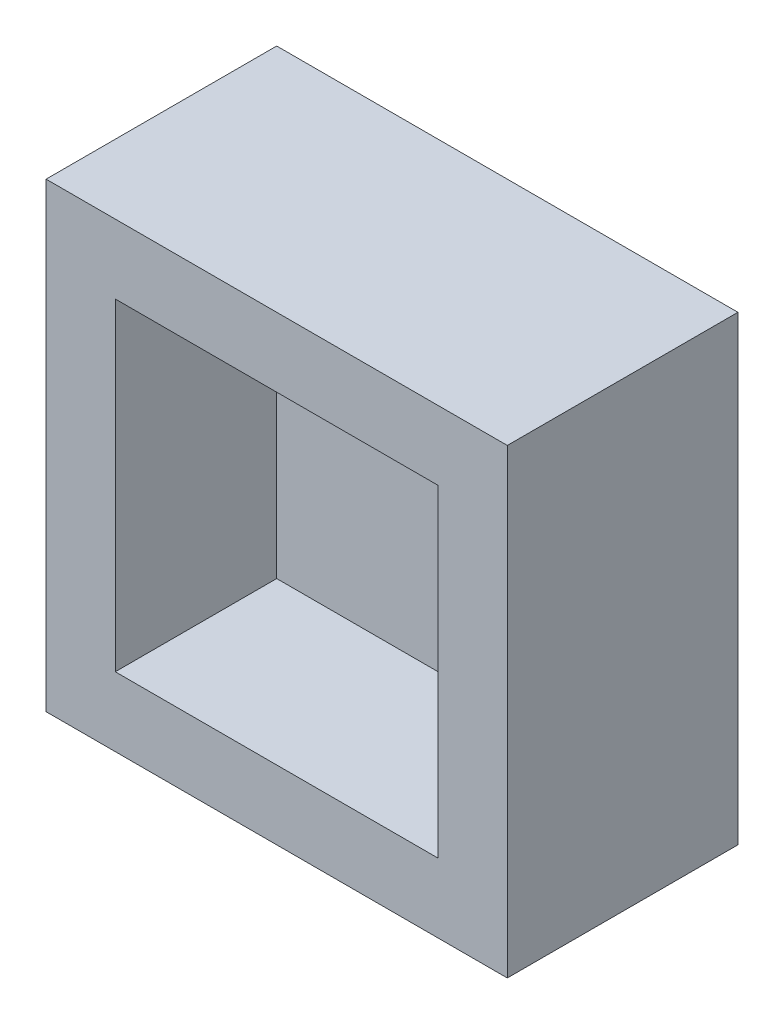
ISO-10303-21;
HEADER;
FILE_DESCRIPTION(('STEP AP214'),'2;1');
FILE_NAME('part.step','',(''),(''),'','','');
FILE_SCHEMA(('AUTOMOTIVE_DESIGN { 1 0 10303 214 1 1 1 1 }'));
ENDSEC;
DATA;
#1=APPLICATION_CONTEXT('core data for automotive mechanical design processes');
#2=APPLICATION_PROTOCOL_DEFINITION('international standard','automotive_design',2000,#1);
#3=PRODUCT_CONTEXT('',#1,'mechanical');
#4=PRODUCT('Part','Part','',(#3));
#5=PRODUCT_RELATED_PRODUCT_CATEGORY('part','',(#4));
#6=PRODUCT_DEFINITION_FORMATION('','',#4);
#7=PRODUCT_DEFINITION_CONTEXT('part definition',#1,'design');
#8=PRODUCT_DEFINITION('design','',#6,#7);
#9=PRODUCT_DEFINITION_SHAPE('','',#8);
#10=(LENGTH_UNIT() NAMED_UNIT(*) SI_UNIT(.MILLI.,.METRE.));
#11=(NAMED_UNIT(*) PLANE_ANGLE_UNIT() SI_UNIT($,.RADIAN.));
#12=(NAMED_UNIT(*) SI_UNIT($,.STERADIAN.) SOLID_ANGLE_UNIT());
#13=UNCERTAINTY_MEASURE_WITH_UNIT(LENGTH_MEASURE(1.E-05),#10,'distance_accuracy_value','');
#14=(GEOMETRIC_REPRESENTATION_CONTEXT(3) GLOBAL_UNCERTAINTY_ASSIGNED_CONTEXT((#13)) GLOBAL_UNIT_ASSIGNED_CONTEXT((#10,
#11,#12)) REPRESENTATION_CONTEXT('',''));
#15=CARTESIAN_POINT('',(0.,0.,0.));
#16=DIRECTION('',(0.,0.,1.));
#17=DIRECTION('',(1.,0.,0.));
#18=AXIS2_PLACEMENT_3D('',#15,#16,#17);
#19=CARTESIAN_POINT('',(0.,0.,10.));
#20=DIRECTION('',(0.,0.,-1.));
#21=DIRECTION('',(-1.,0.,0.));
#22=AXIS2_PLACEMENT_3D('',#19,#20,#21);
#23=PLANE('',#22);
#24=DIRECTION('',(0.,-1.,0.));
#25=VECTOR('',#24,1.);
#26=CARTESIAN_POINT('',(0.,0.,10.));
#27=LINE('',#26,#25);
#28=CARTESIAN_POINT('',(0.,20.,10.));
#29=VERTEX_POINT('',#28);
#30=CARTESIAN_POINT('',(0.,0.,10.));
#31=VERTEX_POINT('',#30);
#32=EDGE_CURVE('E147',#29,#31,#27,.T.);
#33=ORIENTED_EDGE('',*,*,#32,.T.);
#34=DIRECTION('',(1.,0.,0.));
#35=VECTOR('',#34,1.);
#36=CARTESIAN_POINT('',(0.,0.,10.));
#37=LINE('',#36,#35);
#38=CARTESIAN_POINT('',(20.,0.,10.));
#39=VERTEX_POINT('',#38);
#40=EDGE_CURVE('E94',#31,#39,#37,.T.);
#41=ORIENTED_EDGE('',*,*,#40,.T.);
#42=DIRECTION('',(0.,1.,0.));
#43=VECTOR('',#42,1.);
#44=CARTESIAN_POINT('',(20.,0.,10.));
#45=LINE('',#44,#43);
#46=CARTESIAN_POINT('',(20.,20.,10.));
#47=VERTEX_POINT('',#46);
#48=EDGE_CURVE('E153',#39,#47,#45,.T.);
#49=ORIENTED_EDGE('',*,*,#48,.T.);
#50=DIRECTION('',(-1.,0.,0.));
#51=VECTOR('',#50,1.);
#52=CARTESIAN_POINT('',(0.,20.,10.));
#53=LINE('',#52,#51);
#54=EDGE_CURVE('E68',#47,#29,#53,.T.);
#55=ORIENTED_EDGE('',*,*,#54,.T.);
#56=EDGE_LOOP('',(#33,#41,#49,#55));
#57=FACE_BOUND('',#56,.T.);
#58=DIRECTION('',(0.,-1.,0.));
#59=VECTOR('',#58,1.);
#60=CARTESIAN_POINT('',(3.,0.,10.));
#61=LINE('',#60,#59);
#62=CARTESIAN_POINT('',(3.,17.,10.));
#63=VERTEX_POINT('',#62);
#64=CARTESIAN_POINT('',(3.,3.,10.));
#65=VERTEX_POINT('',#64);
#66=EDGE_CURVE('E138',#63,#65,#61,.T.);
#67=ORIENTED_EDGE('',*,*,#66,.F.);
#68=DIRECTION('',(-1.,0.,0.));
#69=VECTOR('',#68,1.);
#70=CARTESIAN_POINT('',(0.,17.,10.));
#71=LINE('',#70,#69);
#72=CARTESIAN_POINT('',(17.,17.,10.));
#73=VERTEX_POINT('',#72);
#74=EDGE_CURVE('E146',#73,#63,#71,.T.);
#75=ORIENTED_EDGE('',*,*,#74,.F.);
#76=DIRECTION('',(0.,1.,0.));
#77=VECTOR('',#76,1.);
#78=CARTESIAN_POINT('',(17.,0.,10.));
#79=LINE('',#78,#77);
#80=CARTESIAN_POINT('',(17.,3.,10.));
#81=VERTEX_POINT('',#80);
#82=EDGE_CURVE('E148',#81,#73,#79,.T.);
#83=ORIENTED_EDGE('',*,*,#82,.F.);
#84=DIRECTION('',(1.,0.,0.));
#85=VECTOR('',#84,1.);
#86=CARTESIAN_POINT('',(0.,3.,10.));
#87=LINE('',#86,#85);
#88=EDGE_CURVE('E133',#65,#81,#87,.T.);
#89=ORIENTED_EDGE('',*,*,#88,.F.);
#90=EDGE_LOOP('',(#67,#75,#83,#89));
#91=FACE_BOUND('',#90,.T.);
#92=ADVANCED_FACE('F45',(#57,#91),#23,.F.);
#93=CARTESIAN_POINT('',(0.,0.,10.));
#94=DIRECTION('',(1.,0.,0.));
#95=DIRECTION('',(0.,0.,-1.));
#96=AXIS2_PLACEMENT_3D('',#93,#94,#95);
#97=PLANE('',#96);
#98=DIRECTION('',(0.,-1.,0.));
#99=VECTOR('',#98,1.);
#100=CARTESIAN_POINT('',(0.,0.,0.));
#101=LINE('',#100,#99);
#102=CARTESIAN_POINT('',(0.,20.,0.));
#103=VERTEX_POINT('',#102);
#104=CARTESIAN_POINT('',(0.,0.,0.));
#105=VERTEX_POINT('',#104);
#106=EDGE_CURVE('E160',#103,#105,#101,.T.);
#107=ORIENTED_EDGE('',*,*,#106,.T.);
#108=DIRECTION('',(0.,0.,-1.));
#109=VECTOR('',#108,1.);
#110=CARTESIAN_POINT('',(0.,0.,10.));
#111=LINE('',#110,#109);
#112=EDGE_CURVE('E11',#31,#105,#111,.T.);
#113=ORIENTED_EDGE('',*,*,#112,.F.);
#114=ORIENTED_EDGE('',*,*,#32,.F.);
#115=DIRECTION('',(0.,0.,-1.));
#116=VECTOR('',#115,1.);
#117=CARTESIAN_POINT('',(0.,20.,10.));
#118=LINE('',#117,#116);
#119=EDGE_CURVE('E156',#29,#103,#118,.T.);
#120=ORIENTED_EDGE('',*,*,#119,.T.);
#121=EDGE_LOOP('',(#107,#113,#114,#120));
#122=FACE_BOUND('',#121,.T.);
#123=ADVANCED_FACE('F42',(#122),#97,.F.);
#124=CARTESIAN_POINT('',(0.,0.,10.));
#125=DIRECTION('',(0.,1.,0.));
#126=DIRECTION('',(0.,0.,1.));
#127=AXIS2_PLACEMENT_3D('',#124,#125,#126);
#128=PLANE('',#127);
#129=DIRECTION('',(1.,0.,0.));
#130=VECTOR('',#129,1.);
#131=CARTESIAN_POINT('',(0.,0.,0.));
#132=LINE('',#131,#130);
#133=CARTESIAN_POINT('',(20.,0.,0.));
#134=VERTEX_POINT('',#133);
#135=EDGE_CURVE('E159',#105,#134,#132,.T.);
#136=ORIENTED_EDGE('',*,*,#135,.T.);
#137=DIRECTION('',(0.,0.,-1.));
#138=VECTOR('',#137,1.);
#139=CARTESIAN_POINT('',(20.,0.,10.));
#140=LINE('',#139,#138);
#141=EDGE_CURVE('E49',#39,#134,#140,.T.);
#142=ORIENTED_EDGE('',*,*,#141,.F.);
#143=ORIENTED_EDGE('',*,*,#40,.F.);
#144=ORIENTED_EDGE('',*,*,#112,.T.);
#145=EDGE_LOOP('',(#136,#142,#143,#144));
#146=FACE_BOUND('',#145,.T.);
#147=ADVANCED_FACE('F187',(#146),#128,.F.);
#148=CARTESIAN_POINT('',(20.,0.,10.));
#149=DIRECTION('',(-1.,0.,0.));
#150=DIRECTION('',(0.,0.,1.));
#151=AXIS2_PLACEMENT_3D('',#148,#149,#150);
#152=PLANE('',#151);
#153=DIRECTION('',(0.,1.,0.));
#154=VECTOR('',#153,1.);
#155=CARTESIAN_POINT('',(20.,0.,0.));
#156=LINE('',#155,#154);
#157=CARTESIAN_POINT('',(20.,20.,0.));
#158=VERTEX_POINT('',#157);
#159=EDGE_CURVE('E165',#134,#158,#156,.T.);
#160=ORIENTED_EDGE('',*,*,#159,.T.);
#161=DIRECTION('',(0.,0.,-1.));
#162=VECTOR('',#161,1.);
#163=CARTESIAN_POINT('',(20.,20.,10.));
#164=LINE('',#163,#162);
#165=EDGE_CURVE('E167',#47,#158,#164,.T.);
#166=ORIENTED_EDGE('',*,*,#165,.F.);
#167=ORIENTED_EDGE('',*,*,#48,.F.);
#168=ORIENTED_EDGE('',*,*,#141,.T.);
#169=EDGE_LOOP('',(#160,#166,#167,#168));
#170=FACE_BOUND('',#169,.T.);
#171=ADVANCED_FACE('F173',(#170),#152,.F.);
#172=CARTESIAN_POINT('',(0.,20.,10.));
#173=DIRECTION('',(0.,-1.,0.));
#174=DIRECTION('',(0.,0.,-1.));
#175=AXIS2_PLACEMENT_3D('',#172,#173,#174);
#176=PLANE('',#175);
#177=DIRECTION('',(-1.,0.,0.));
#178=VECTOR('',#177,1.);
#179=CARTESIAN_POINT('',(0.,20.,0.));
#180=LINE('',#179,#178);
#181=EDGE_CURVE('E87',#158,#103,#180,.T.);
#182=ORIENTED_EDGE('',*,*,#181,.T.);
#183=ORIENTED_EDGE('',*,*,#119,.F.);
#184=ORIENTED_EDGE('',*,*,#54,.F.);
#185=ORIENTED_EDGE('',*,*,#165,.T.);
#186=EDGE_LOOP('',(#182,#183,#184,#185));
#187=FACE_BOUND('',#186,.T.);
#188=ADVANCED_FACE('F179',(#187),#176,.F.);
#189=CARTESIAN_POINT('',(0.,0.,0.));
#190=DIRECTION('',(0.,0.,-1.));
#191=DIRECTION('',(-1.,0.,0.));
#192=AXIS2_PLACEMENT_3D('',#189,#190,#191);
#193=PLANE('',#192);
#194=ORIENTED_EDGE('',*,*,#106,.F.);
#195=ORIENTED_EDGE('',*,*,#181,.F.);
#196=ORIENTED_EDGE('',*,*,#159,.F.);
#197=ORIENTED_EDGE('',*,*,#135,.F.);
#198=EDGE_LOOP('',(#194,#195,#196,#197));
#199=FACE_BOUND('',#198,.T.);
#200=ADVANCED_FACE('F171',(#199),#193,.T.);
#201=CARTESIAN_POINT('',(3.,0.,10.));
#202=DIRECTION('',(1.,0.,0.));
#203=DIRECTION('',(0.,0.,-1.));
#204=AXIS2_PLACEMENT_3D('',#201,#202,#203);
#205=PLANE('',#204);
#206=DIRECTION('',(0.,-1.,0.));
#207=VECTOR('',#206,1.);
#208=CARTESIAN_POINT('',(3.,0.,3.));
#209=LINE('',#208,#207);
#210=CARTESIAN_POINT('',(3.,17.,3.));
#211=VERTEX_POINT('',#210);
#212=CARTESIAN_POINT('',(3.,3.,3.));
#213=VERTEX_POINT('',#212);
#214=EDGE_CURVE('E125',#211,#213,#209,.T.);
#215=ORIENTED_EDGE('',*,*,#214,.F.);
#216=DIRECTION('',(0.,0.,-1.));
#217=VECTOR('',#216,1.);
#218=CARTESIAN_POINT('',(3.,17.,10.));
#219=LINE('',#218,#217);
#220=EDGE_CURVE('E142',#63,#211,#219,.T.);
#221=ORIENTED_EDGE('',*,*,#220,.F.);
#222=ORIENTED_EDGE('',*,*,#66,.T.);
#223=DIRECTION('',(0.,0.,-1.));
#224=VECTOR('',#223,1.);
#225=CARTESIAN_POINT('',(3.,3.,10.));
#226=LINE('',#225,#224);
#227=EDGE_CURVE('E135',#65,#213,#226,.T.);
#228=ORIENTED_EDGE('',*,*,#227,.T.);
#229=EDGE_LOOP('',(#215,#221,#222,#228));
#230=FACE_BOUND('',#229,.T.);
#231=ADVANCED_FACE('F188',(#230),#205,.T.);
#232=CARTESIAN_POINT('',(0.,3.,10.));
#233=DIRECTION('',(0.,1.,0.));
#234=DIRECTION('',(0.,0.,1.));
#235=AXIS2_PLACEMENT_3D('',#232,#233,#234);
#236=PLANE('',#235);
#237=DIRECTION('',(1.,0.,0.));
#238=VECTOR('',#237,1.);
#239=CARTESIAN_POINT('',(0.,3.,3.));
#240=LINE('',#239,#238);
#241=CARTESIAN_POINT('',(17.,3.,3.));
#242=VERTEX_POINT('',#241);
#243=EDGE_CURVE('E118',#213,#242,#240,.T.);
#244=ORIENTED_EDGE('',*,*,#243,.F.);
#245=ORIENTED_EDGE('',*,*,#227,.F.);
#246=ORIENTED_EDGE('',*,*,#88,.T.);
#247=DIRECTION('',(0.,0.,-1.));
#248=VECTOR('',#247,1.);
#249=CARTESIAN_POINT('',(17.,3.,10.));
#250=LINE('',#249,#248);
#251=EDGE_CURVE('E126',#81,#242,#250,.T.);
#252=ORIENTED_EDGE('',*,*,#251,.T.);
#253=EDGE_LOOP('',(#244,#245,#246,#252));
#254=FACE_BOUND('',#253,.T.);
#255=ADVANCED_FACE('F129',(#254),#236,.T.);
#256=CARTESIAN_POINT('',(17.,0.,10.));
#257=DIRECTION('',(-1.,0.,0.));
#258=DIRECTION('',(0.,0.,1.));
#259=AXIS2_PLACEMENT_3D('',#256,#257,#258);
#260=PLANE('',#259);
#261=DIRECTION('',(0.,1.,0.));
#262=VECTOR('',#261,1.);
#263=CARTESIAN_POINT('',(17.,0.,3.));
#264=LINE('',#263,#262);
#265=CARTESIAN_POINT('',(17.,17.,3.));
#266=VERTEX_POINT('',#265);
#267=EDGE_CURVE('E116',#242,#266,#264,.T.);
#268=ORIENTED_EDGE('',*,*,#267,.F.);
#269=ORIENTED_EDGE('',*,*,#251,.F.);
#270=ORIENTED_EDGE('',*,*,#82,.T.);
#271=DIRECTION('',(0.,0.,-1.));
#272=VECTOR('',#271,1.);
#273=CARTESIAN_POINT('',(17.,17.,10.));
#274=LINE('',#273,#272);
#275=EDGE_CURVE('E60',#73,#266,#274,.T.);
#276=ORIENTED_EDGE('',*,*,#275,.T.);
#277=EDGE_LOOP('',(#268,#269,#270,#276));
#278=FACE_BOUND('',#277,.T.);
#279=ADVANCED_FACE('F136',(#278),#260,.T.);
#280=CARTESIAN_POINT('',(0.,17.,10.));
#281=DIRECTION('',(0.,-1.,0.));
#282=DIRECTION('',(0.,0.,-1.));
#283=AXIS2_PLACEMENT_3D('',#280,#281,#282);
#284=PLANE('',#283);
#285=DIRECTION('',(-1.,0.,0.));
#286=VECTOR('',#285,1.);
#287=CARTESIAN_POINT('',(0.,17.,3.));
#288=LINE('',#287,#286);
#289=EDGE_CURVE('E137',#266,#211,#288,.T.);
#290=ORIENTED_EDGE('',*,*,#289,.F.);
#291=ORIENTED_EDGE('',*,*,#275,.F.);
#292=ORIENTED_EDGE('',*,*,#74,.T.);
#293=ORIENTED_EDGE('',*,*,#220,.T.);
#294=EDGE_LOOP('',(#290,#291,#292,#293));
#295=FACE_BOUND('',#294,.T.);
#296=ADVANCED_FACE('F199',(#295),#284,.T.);
#297=CARTESIAN_POINT('',(0.,0.,3.));
#298=DIRECTION('',(0.,0.,-1.));
#299=DIRECTION('',(-1.,0.,0.));
#300=AXIS2_PLACEMENT_3D('',#297,#298,#299);
#301=PLANE('',#300);
#302=ORIENTED_EDGE('',*,*,#214,.T.);
#303=ORIENTED_EDGE('',*,*,#243,.T.);
#304=ORIENTED_EDGE('',*,*,#267,.T.);
#305=ORIENTED_EDGE('',*,*,#289,.T.);
#306=EDGE_LOOP('',(#302,#303,#304,#305));
#307=FACE_BOUND('',#306,.T.);
#308=ADVANCED_FACE('F117',(#307),#301,.F.);
#309=CLOSED_SHELL('',(#92,#123,#147,#171,#188,#200,#231,#255,#279,#296,#308));
#310=MANIFOLD_SOLID_BREP('B2',#309);
#311=ADVANCED_BREP_SHAPE_REPRESENTATION('',(#18,#310),#14);
#312=SHAPE_DEFINITION_REPRESENTATION(#9,#311);
ENDSEC;
END-ISO-10303-21;
